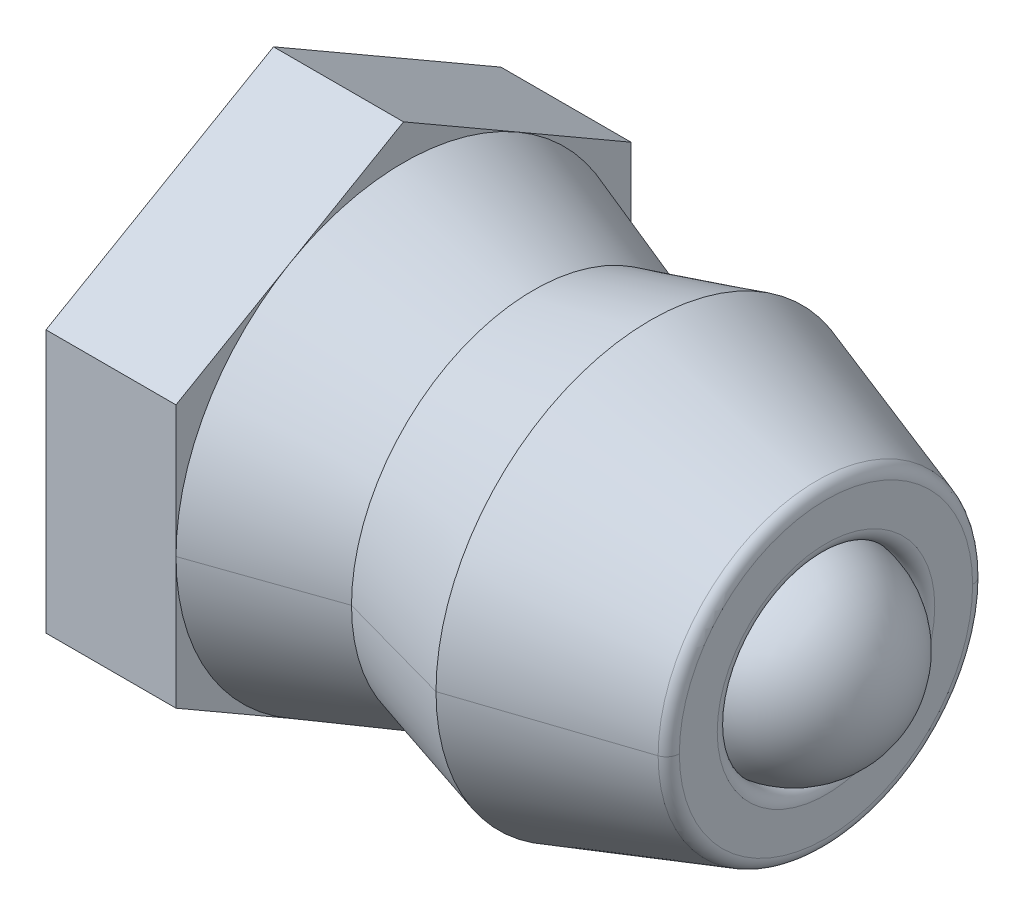
ISO-10303-21;
HEADER;
FILE_DESCRIPTION(('STEP AP214'),'2;1');
FILE_NAME('part.step','',(''),(''),'','','');
FILE_SCHEMA(('AUTOMOTIVE_DESIGN { 1 0 10303 214 1 1 1 1 }'));
ENDSEC;
DATA;
#1=APPLICATION_CONTEXT('core data for automotive mechanical design processes');
#2=APPLICATION_PROTOCOL_DEFINITION('international standard','automotive_design',2000,#1);
#3=PRODUCT_CONTEXT('',#1,'mechanical');
#4=PRODUCT('Part','Part','',(#3));
#5=PRODUCT_RELATED_PRODUCT_CATEGORY('part','',(#4));
#6=PRODUCT_DEFINITION_FORMATION('','',#4);
#7=PRODUCT_DEFINITION_CONTEXT('part definition',#1,'design');
#8=PRODUCT_DEFINITION('design','',#6,#7);
#9=PRODUCT_DEFINITION_SHAPE('','',#8);
#10=(LENGTH_UNIT() NAMED_UNIT(*) SI_UNIT(.MILLI.,.METRE.));
#11=(NAMED_UNIT(*) PLANE_ANGLE_UNIT() SI_UNIT($,.RADIAN.));
#12=(NAMED_UNIT(*) SI_UNIT($,.STERADIAN.) SOLID_ANGLE_UNIT());
#13=UNCERTAINTY_MEASURE_WITH_UNIT(LENGTH_MEASURE(1.E-05),#10,'distance_accuracy_value','');
#14=(GEOMETRIC_REPRESENTATION_CONTEXT(3) GLOBAL_UNCERTAINTY_ASSIGNED_CONTEXT((#13)) GLOBAL_UNIT_ASSIGNED_CONTEXT((#10,
#11,#12)) REPRESENTATION_CONTEXT('',''));
#15=CARTESIAN_POINT('',(0.,0.,0.));
#16=DIRECTION('',(0.,0.,1.));
#17=DIRECTION('',(1.,0.,0.));
#18=AXIS2_PLACEMENT_3D('',#15,#16,#17);
#19=CARTESIAN_POINT('',(8.,0.,0.));
#20=DIRECTION('',(-1.,0.,0.));
#21=DIRECTION('',(0.,0.,-1.));
#22=AXIS2_PLACEMENT_3D('',#19,#20,#21);
#23=SPHERICAL_SURFACE('',#22,1.5);
#24=CARTESIAN_POINT('',(6.5,0.,0.));
#25=VERTEX_POINT('',#24);
#26=VERTEX_LOOP('',#25);
#27=FACE_BOUND('',#26,.T.);
#28=ADVANCED_FACE('F40',(#27),#23,.T.);
#29=CLOSED_SHELL('',(#28));
#30=MANIFOLD_SOLID_BREP('B2',#29);
#31=CARTESIAN_POINT('',(2.,-4.0414518843274,0.));
#32=DIRECTION('',(0.,0.866025403784438,0.500000000000002));
#33=DIRECTION('',(0.,-0.500000000000002,0.866025403784438));
#34=AXIS2_PLACEMENT_3D('',#31,#32,#33);
#35=PLANE('',#34);
#36=DIRECTION('',(0.,0.500000000000002,-0.866025403784438));
#37=VECTOR('',#36,1.);
#38=CARTESIAN_POINT('',(0.,-4.0414518843274,0.));
#39=LINE('',#38,#37);
#40=CARTESIAN_POINT('',(0.,-4.0414518843274,0.));
#41=VERTEX_POINT('',#40);
#42=CARTESIAN_POINT('',(0.,-2.0207259421637,-3.5));
#43=VERTEX_POINT('',#42);
#44=EDGE_CURVE('E387',#41,#43,#39,.T.);
#45=ORIENTED_EDGE('',*,*,#44,.T.);
#46=DIRECTION('',(-1.,0.,0.));
#47=VECTOR('',#46,1.);
#48=CARTESIAN_POINT('',(2.,-2.0207259421637,-3.5));
#49=LINE('',#48,#47);
#50=CARTESIAN_POINT('',(2.,-2.0207259421637,-3.5));
#51=VERTEX_POINT('',#50);
#52=EDGE_CURVE('E382',#51,#43,#49,.T.);
#53=ORIENTED_EDGE('',*,*,#52,.F.);
#54=DIRECTION('',(0.,0.500000000000002,-0.866025403784438));
#55=VECTOR('',#54,1.);
#56=CARTESIAN_POINT('',(2.,-4.0414518843274,0.));
#57=LINE('',#56,#55);
#58=CARTESIAN_POINT('',(2.,-3.03108891324554,-1.75000000000001));
#59=VERTEX_POINT('',#58);
#60=EDGE_CURVE('E377',#59,#51,#57,.T.);
#61=ORIENTED_EDGE('',*,*,#60,.F.);
#62=DIRECTION('',(0.,0.500000000000002,-0.866025403784438));
#63=VECTOR('',#62,1.);
#64=CARTESIAN_POINT('',(2.,-4.0414518843274,0.));
#65=LINE('',#64,#63);
#66=CARTESIAN_POINT('',(2.,-4.0414518843274,0.));
#67=VERTEX_POINT('',#66);
#68=EDGE_CURVE('E372',#67,#59,#65,.T.);
#69=ORIENTED_EDGE('',*,*,#68,.F.);
#70=DIRECTION('',(-1.,0.,0.));
#71=VECTOR('',#70,1.);
#72=CARTESIAN_POINT('',(2.,-4.0414518843274,0.));
#73=LINE('',#72,#71);
#74=EDGE_CURVE('E368',#67,#41,#73,.T.);
#75=ORIENTED_EDGE('',*,*,#74,.T.);
#76=EDGE_LOOP('',(#45,#53,#61,#69,#75));
#77=FACE_BOUND('',#76,.T.);
#78=ADVANCED_FACE('F52',(#77),#35,.F.);
#79=CARTESIAN_POINT('',(2.,-2.0207259421637,3.5));
#80=DIRECTION('',(0.,0.866025403784438,-0.500000000000002));
#81=DIRECTION('',(0.,0.500000000000002,0.866025403784438));
#82=AXIS2_PLACEMENT_3D('',#79,#80,#81);
#83=PLANE('',#82);
#84=DIRECTION('',(0.,-0.500000000000002,-0.866025403784438));
#85=VECTOR('',#84,1.);
#86=CARTESIAN_POINT('',(0.,-2.0207259421637,3.5));
#87=LINE('',#86,#85);
#88=CARTESIAN_POINT('',(0.,-2.0207259421637,3.5));
#89=VERTEX_POINT('',#88);
#90=EDGE_CURVE('E363',#89,#41,#87,.T.);
#91=ORIENTED_EDGE('',*,*,#90,.T.);
#92=ORIENTED_EDGE('',*,*,#74,.F.);
#93=DIRECTION('',(0.,-0.500000000000002,-0.866025403784438));
#94=VECTOR('',#93,1.);
#95=CARTESIAN_POINT('',(2.,-2.0207259421637,3.5));
#96=LINE('',#95,#94);
#97=CARTESIAN_POINT('',(2.,-3.03108891324554,1.75000000000001));
#98=VERTEX_POINT('',#97);
#99=EDGE_CURVE('E358',#98,#67,#96,.T.);
#100=ORIENTED_EDGE('',*,*,#99,.F.);
#101=DIRECTION('',(0.,-0.500000000000002,-0.866025403784438));
#102=VECTOR('',#101,1.);
#103=CARTESIAN_POINT('',(2.,-2.0207259421637,3.5));
#104=LINE('',#103,#102);
#105=CARTESIAN_POINT('',(2.,-2.0207259421637,3.5));
#106=VERTEX_POINT('',#105);
#107=EDGE_CURVE('E353',#106,#98,#104,.T.);
#108=ORIENTED_EDGE('',*,*,#107,.F.);
#109=DIRECTION('',(-1.,0.,0.));
#110=VECTOR('',#109,1.);
#111=CARTESIAN_POINT('',(2.,-2.0207259421637,3.5));
#112=LINE('',#111,#110);
#113=EDGE_CURVE('E349',#106,#89,#112,.T.);
#114=ORIENTED_EDGE('',*,*,#113,.T.);
#115=EDGE_LOOP('',(#91,#92,#100,#108,#114));
#116=FACE_BOUND('',#115,.T.);
#117=ADVANCED_FACE('F487',(#116),#83,.F.);
#118=CARTESIAN_POINT('',(2.,2.0207259421637,3.5));
#119=DIRECTION('',(0.,0.,-1.));
#120=DIRECTION('',(-1.,0.,0.));
#121=AXIS2_PLACEMENT_3D('',#118,#119,#120);
#122=PLANE('',#121);
#123=DIRECTION('',(0.,-1.,0.));
#124=VECTOR('',#123,1.);
#125=CARTESIAN_POINT('',(0.,2.0207259421637,3.5));
#126=LINE('',#125,#124);
#127=CARTESIAN_POINT('',(0.,2.0207259421637,3.5));
#128=VERTEX_POINT('',#127);
#129=EDGE_CURVE('E344',#128,#89,#126,.T.);
#130=ORIENTED_EDGE('',*,*,#129,.T.);
#131=ORIENTED_EDGE('',*,*,#113,.F.);
#132=DIRECTION('',(0.,-1.,0.));
#133=VECTOR('',#132,1.);
#134=CARTESIAN_POINT('',(2.,2.0207259421637,3.5));
#135=LINE('',#134,#133);
#136=CARTESIAN_POINT('',(2.,0.,3.5));
#137=VERTEX_POINT('',#136);
#138=EDGE_CURVE('E339',#137,#106,#135,.T.);
#139=ORIENTED_EDGE('',*,*,#138,.F.);
#140=DIRECTION('',(0.,-1.,0.));
#141=VECTOR('',#140,1.);
#142=CARTESIAN_POINT('',(2.,2.0207259421637,3.5));
#143=LINE('',#142,#141);
#144=CARTESIAN_POINT('',(2.,2.0207259421637,3.5));
#145=VERTEX_POINT('',#144);
#146=EDGE_CURVE('E334',#145,#137,#143,.T.);
#147=ORIENTED_EDGE('',*,*,#146,.F.);
#148=DIRECTION('',(-1.,0.,0.));
#149=VECTOR('',#148,1.);
#150=CARTESIAN_POINT('',(2.,2.0207259421637,3.5));
#151=LINE('',#150,#149);
#152=EDGE_CURVE('E330',#145,#128,#151,.T.);
#153=ORIENTED_EDGE('',*,*,#152,.T.);
#154=EDGE_LOOP('',(#130,#131,#139,#147,#153));
#155=FACE_BOUND('',#154,.T.);
#156=ADVANCED_FACE('F493',(#155),#122,.F.);
#157=CARTESIAN_POINT('',(2.,4.0414518843274,0.));
#158=DIRECTION('',(0.,-0.866025403784438,-0.500000000000002));
#159=DIRECTION('',(0.,0.500000000000002,-0.866025403784438));
#160=AXIS2_PLACEMENT_3D('',#157,#158,#159);
#161=PLANE('',#160);
#162=DIRECTION('',(0.,-0.500000000000002,0.866025403784438));
#163=VECTOR('',#162,1.);
#164=CARTESIAN_POINT('',(0.,4.0414518843274,0.));
#165=LINE('',#164,#163);
#166=CARTESIAN_POINT('',(0.,4.0414518843274,0.));
#167=VERTEX_POINT('',#166);
#168=EDGE_CURVE('E325',#167,#128,#165,.T.);
#169=ORIENTED_EDGE('',*,*,#168,.T.);
#170=ORIENTED_EDGE('',*,*,#152,.F.);
#171=DIRECTION('',(0.,-0.500000000000002,0.866025403784438));
#172=VECTOR('',#171,1.);
#173=CARTESIAN_POINT('',(2.,4.0414518843274,0.));
#174=LINE('',#173,#172);
#175=CARTESIAN_POINT('',(2.,3.03108891324554,1.75000000000001));
#176=VERTEX_POINT('',#175);
#177=EDGE_CURVE('E320',#176,#145,#174,.T.);
#178=ORIENTED_EDGE('',*,*,#177,.F.);
#179=DIRECTION('',(0.,-0.500000000000002,0.866025403784438));
#180=VECTOR('',#179,1.);
#181=CARTESIAN_POINT('',(2.,4.0414518843274,0.));
#182=LINE('',#181,#180);
#183=CARTESIAN_POINT('',(2.,4.0414518843274,0.));
#184=VERTEX_POINT('',#183);
#185=EDGE_CURVE('E315',#184,#176,#182,.T.);
#186=ORIENTED_EDGE('',*,*,#185,.F.);
#187=DIRECTION('',(-1.,0.,0.));
#188=VECTOR('',#187,1.);
#189=CARTESIAN_POINT('',(2.,4.0414518843274,0.));
#190=LINE('',#189,#188);
#191=EDGE_CURVE('E311',#184,#167,#190,.T.);
#192=ORIENTED_EDGE('',*,*,#191,.T.);
#193=EDGE_LOOP('',(#169,#170,#178,#186,#192));
#194=FACE_BOUND('',#193,.T.);
#195=ADVANCED_FACE('F581',(#194),#161,.F.);
#196=CARTESIAN_POINT('',(2.,2.0207259421637,-3.5));
#197=DIRECTION('',(0.,-0.866025403784438,0.500000000000002));
#198=DIRECTION('',(0.,-0.500000000000002,-0.866025403784438));
#199=AXIS2_PLACEMENT_3D('',#196,#197,#198);
#200=PLANE('',#199);
#201=DIRECTION('',(0.,0.500000000000002,0.866025403784438));
#202=VECTOR('',#201,1.);
#203=CARTESIAN_POINT('',(0.,2.0207259421637,-3.5));
#204=LINE('',#203,#202);
#205=CARTESIAN_POINT('',(0.,2.0207259421637,-3.5));
#206=VERTEX_POINT('',#205);
#207=EDGE_CURVE('E306',#206,#167,#204,.T.);
#208=ORIENTED_EDGE('',*,*,#207,.T.);
#209=ORIENTED_EDGE('',*,*,#191,.F.);
#210=DIRECTION('',(0.,0.500000000000002,0.866025403784438));
#211=VECTOR('',#210,1.);
#212=CARTESIAN_POINT('',(2.,2.0207259421637,-3.5));
#213=LINE('',#212,#211);
#214=CARTESIAN_POINT('',(2.,3.03108891324554,-1.75000000000001));
#215=VERTEX_POINT('',#214);
#216=EDGE_CURVE('E301',#215,#184,#213,.T.);
#217=ORIENTED_EDGE('',*,*,#216,.F.);
#218=DIRECTION('',(0.,0.500000000000002,0.866025403784438));
#219=VECTOR('',#218,1.);
#220=CARTESIAN_POINT('',(2.,2.0207259421637,-3.5));
#221=LINE('',#220,#219);
#222=CARTESIAN_POINT('',(2.,2.0207259421637,-3.5));
#223=VERTEX_POINT('',#222);
#224=EDGE_CURVE('E296',#223,#215,#221,.T.);
#225=ORIENTED_EDGE('',*,*,#224,.F.);
#226=DIRECTION('',(-1.,0.,0.));
#227=VECTOR('',#226,1.);
#228=CARTESIAN_POINT('',(2.,2.0207259421637,-3.5));
#229=LINE('',#228,#227);
#230=EDGE_CURVE('E292',#223,#206,#229,.T.);
#231=ORIENTED_EDGE('',*,*,#230,.T.);
#232=EDGE_LOOP('',(#208,#209,#217,#225,#231));
#233=FACE_BOUND('',#232,.T.);
#234=ADVANCED_FACE('F576',(#233),#200,.F.);
#235=CARTESIAN_POINT('',(2.,-2.0207259421637,-3.5));
#236=DIRECTION('',(0.,0.,1.));
#237=DIRECTION('',(1.,0.,0.));
#238=AXIS2_PLACEMENT_3D('',#235,#236,#237);
#239=PLANE('',#238);
#240=DIRECTION('',(0.,1.,0.));
#241=VECTOR('',#240,1.);
#242=CARTESIAN_POINT('',(0.,-2.0207259421637,-3.5));
#243=LINE('',#242,#241);
#244=EDGE_CURVE('E287',#43,#206,#243,.T.);
#245=ORIENTED_EDGE('',*,*,#244,.T.);
#246=ORIENTED_EDGE('',*,*,#230,.F.);
#247=DIRECTION('',(0.,1.,0.));
#248=VECTOR('',#247,1.);
#249=CARTESIAN_POINT('',(2.,-2.0207259421637,-3.5));
#250=LINE('',#249,#248);
#251=CARTESIAN_POINT('',(2.,0.,-3.5));
#252=VERTEX_POINT('',#251);
#253=EDGE_CURVE('E282',#252,#223,#250,.T.);
#254=ORIENTED_EDGE('',*,*,#253,.F.);
#255=DIRECTION('',(0.,1.,0.));
#256=VECTOR('',#255,1.);
#257=CARTESIAN_POINT('',(2.,-2.0207259421637,-3.5));
#258=LINE('',#257,#256);
#259=EDGE_CURVE('E277',#51,#252,#258,.T.);
#260=ORIENTED_EDGE('',*,*,#259,.F.);
#261=ORIENTED_EDGE('',*,*,#52,.T.);
#262=EDGE_LOOP('',(#245,#246,#254,#260,#261));
#263=FACE_BOUND('',#262,.T.);
#264=ADVANCED_FACE('F566',(#263),#239,.F.);
#265=CARTESIAN_POINT('',(2.,4.2,0.));
#266=DIRECTION('',(-1.,0.,0.));
#267=DIRECTION('',(0.,0.,1.));
#268=AXIS2_PLACEMENT_3D('',#265,#266,#267);
#269=PLANE('',#268);
#270=ORIENTED_EDGE('',*,*,#60,.T.);
#271=ORIENTED_EDGE('',*,*,#259,.T.);
#272=CARTESIAN_POINT('',(2.,0.,0.));
#273=DIRECTION('',(1.,0.,0.));
#274=DIRECTION('',(0.,0.,-1.));
#275=AXIS2_PLACEMENT_3D('',#272,#273,#274);
#276=CIRCLE('',#275,3.5);
#277=EDGE_CURVE('E273',#59,#252,#276,.T.);
#278=ORIENTED_EDGE('',*,*,#277,.F.);
#279=EDGE_LOOP('',(#270,#271,#278));
#280=FACE_BOUND('',#279,.T.);
#281=ADVANCED_FACE('F570',(#280),#269,.F.);
#282=CARTESIAN_POINT('',(2.,0.,0.));
#283=DIRECTION('',(-1.,0.,0.));
#284=DIRECTION('',(0.,1.,0.));
#285=AXIS2_PLACEMENT_3D('',#282,#283,#284);
#286=CONICAL_SURFACE('',#285,3.5,0.336674819386727);
#287=CARTESIAN_POINT('',(2.,0.,0.));
#288=DIRECTION('',(1.,0.,0.));
#289=DIRECTION('',(0.,0.,-1.));
#290=AXIS2_PLACEMENT_3D('',#287,#288,#289);
#291=CIRCLE('',#290,3.5);
#292=EDGE_CURVE('E269',#137,#98,#291,.T.);
#293=ORIENTED_EDGE('',*,*,#292,.T.);
#294=CARTESIAN_POINT('',(2.,0.,0.));
#295=DIRECTION('',(1.,0.,0.));
#296=DIRECTION('',(0.,0.,-1.));
#297=AXIS2_PLACEMENT_3D('',#294,#295,#296);
#298=CIRCLE('',#297,3.5);
#299=EDGE_CURVE('E266',#98,#59,#298,.T.);
#300=ORIENTED_EDGE('',*,*,#299,.T.);
#301=ORIENTED_EDGE('',*,*,#277,.T.);
#302=CARTESIAN_POINT('',(4.,0.,-2.8));
#303=DIRECTION('',(-0.943858356366017,0.,-0.330350424728106));
#304=VECTOR('',#303,1.);
#305=LINE('',#302,#304);
#306=CARTESIAN_POINT('',(4.,0.,-2.8));
#307=VERTEX_POINT('',#306);
#308=EDGE_CURVE('E233',#307,#252,#305,.T.);
#309=ORIENTED_EDGE('',*,*,#308,.F.);
#310=CARTESIAN_POINT('',(4.,0.,0.));
#311=DIRECTION('',(1.,0.,0.));
#312=DIRECTION('',(0.,0.,-1.));
#313=AXIS2_PLACEMENT_3D('',#310,#311,#312);
#314=CIRCLE('',#313,2.8);
#315=CARTESIAN_POINT('',(4.,0.,2.8));
#316=VERTEX_POINT('',#315);
#317=EDGE_CURVE('E252',#316,#307,#314,.T.);
#318=ORIENTED_EDGE('',*,*,#317,.F.);
#319=CARTESIAN_POINT('',(4.,0.,2.8));
#320=DIRECTION('',(-0.943858356366017,0.,0.330350424728106));
#321=VECTOR('',#320,1.);
#322=LINE('',#319,#321);
#323=EDGE_CURVE('E236',#316,#137,#322,.T.);
#324=ORIENTED_EDGE('',*,*,#323,.T.);
#325=EDGE_LOOP('',(#293,#300,#301,#309,#318,#324));
#326=FACE_BOUND('',#325,.T.);
#327=ADVANCED_FACE('F212',(#326),#286,.T.);
#328=CARTESIAN_POINT('',(2.,0.,0.));
#329=DIRECTION('',(-1.,0.,0.));
#330=DIRECTION('',(0.,-1.,0.));
#331=AXIS2_PLACEMENT_3D('',#328,#329,#330);
#332=CONICAL_SURFACE('',#331,3.5,0.336674819386727);
#333=CARTESIAN_POINT('',(4.,0.,0.));
#334=DIRECTION('',(1.,0.,0.));
#335=DIRECTION('',(0.,0.,-1.));
#336=AXIS2_PLACEMENT_3D('',#333,#334,#335);
#337=CIRCLE('',#336,2.8);
#338=EDGE_CURVE('E175',#307,#316,#337,.T.);
#339=ORIENTED_EDGE('',*,*,#338,.F.);
#340=ORIENTED_EDGE('',*,*,#308,.T.);
#341=CARTESIAN_POINT('',(2.,0.,0.));
#342=DIRECTION('',(1.,0.,0.));
#343=DIRECTION('',(0.,0.,-1.));
#344=AXIS2_PLACEMENT_3D('',#341,#342,#343);
#345=CIRCLE('',#344,3.5);
#346=EDGE_CURVE('E237',#252,#215,#345,.T.);
#347=ORIENTED_EDGE('',*,*,#346,.T.);
#348=CARTESIAN_POINT('',(2.,0.,0.));
#349=DIRECTION('',(1.,0.,0.));
#350=DIRECTION('',(0.,0.,-1.));
#351=AXIS2_PLACEMENT_3D('',#348,#349,#350);
#352=CIRCLE('',#351,3.5);
#353=EDGE_CURVE('E190',#215,#176,#352,.T.);
#354=ORIENTED_EDGE('',*,*,#353,.T.);
#355=CARTESIAN_POINT('',(2.,0.,0.));
#356=DIRECTION('',(1.,0.,0.));
#357=DIRECTION('',(0.,0.,-1.));
#358=AXIS2_PLACEMENT_3D('',#355,#356,#357);
#359=CIRCLE('',#358,3.5);
#360=EDGE_CURVE('E187',#176,#137,#359,.T.);
#361=ORIENTED_EDGE('',*,*,#360,.T.);
#362=ORIENTED_EDGE('',*,*,#323,.F.);
#363=EDGE_LOOP('',(#339,#340,#347,#354,#361,#362));
#364=FACE_BOUND('',#363,.T.);
#365=ADVANCED_FACE('F201',(#364),#332,.T.);
#366=CARTESIAN_POINT('',(2.,4.2,0.));
#367=DIRECTION('',(-1.,0.,0.));
#368=DIRECTION('',(0.,0.,1.));
#369=AXIS2_PLACEMENT_3D('',#366,#367,#368);
#370=PLANE('',#369);
#371=ORIENTED_EDGE('',*,*,#360,.F.);
#372=ORIENTED_EDGE('',*,*,#177,.T.);
#373=ORIENTED_EDGE('',*,*,#146,.T.);
#374=EDGE_LOOP('',(#371,#372,#373));
#375=FACE_BOUND('',#374,.T.);
#376=ADVANCED_FACE('F211',(#375),#370,.F.);
#377=CARTESIAN_POINT('',(2.,4.2,0.));
#378=DIRECTION('',(-1.,0.,0.));
#379=DIRECTION('',(0.,0.,1.));
#380=AXIS2_PLACEMENT_3D('',#377,#378,#379);
#381=PLANE('',#380);
#382=ORIENTED_EDGE('',*,*,#353,.F.);
#383=ORIENTED_EDGE('',*,*,#216,.T.);
#384=ORIENTED_EDGE('',*,*,#185,.T.);
#385=EDGE_LOOP('',(#382,#383,#384));
#386=FACE_BOUND('',#385,.T.);
#387=ADVANCED_FACE('F477',(#386),#381,.F.);
#388=CARTESIAN_POINT('',(2.,4.2,0.));
#389=DIRECTION('',(-1.,0.,0.));
#390=DIRECTION('',(0.,0.,1.));
#391=AXIS2_PLACEMENT_3D('',#388,#389,#390);
#392=PLANE('',#391);
#393=ORIENTED_EDGE('',*,*,#253,.T.);
#394=ORIENTED_EDGE('',*,*,#224,.T.);
#395=ORIENTED_EDGE('',*,*,#346,.F.);
#396=EDGE_LOOP('',(#393,#394,#395));
#397=FACE_BOUND('',#396,.T.);
#398=ADVANCED_FACE('F467',(#397),#392,.F.);
#399=CARTESIAN_POINT('',(4.,0.,0.));
#400=DIRECTION('',(1.,0.,0.));
#401=DIRECTION('',(0.,-1.,0.));
#402=AXIS2_PLACEMENT_3D('',#399,#400,#401);
#403=CONICAL_SURFACE('',#402,2.8,0.270946850338421);
#404=CARTESIAN_POINT('',(5.8,0.,0.));
#405=DIRECTION('',(1.,0.,0.));
#406=DIRECTION('',(0.,0.,-1.));
#407=AXIS2_PLACEMENT_3D('',#404,#405,#406);
#408=CIRCLE('',#407,3.3);
#409=CARTESIAN_POINT('',(5.8,0.,-3.3));
#410=VERTEX_POINT('',#409);
#411=CARTESIAN_POINT('',(5.8,0.,3.3));
#412=VERTEX_POINT('',#411);
#413=EDGE_CURVE('E172',#410,#412,#408,.T.);
#414=ORIENTED_EDGE('',*,*,#413,.F.);
#415=CARTESIAN_POINT('',(4.,0.,-2.8));
#416=DIRECTION('',(0.96351790962994,0.,-0.267643863786095));
#417=VECTOR('',#416,1.);
#418=LINE('',#415,#417);
#419=EDGE_CURVE('E179',#307,#410,#418,.T.);
#420=ORIENTED_EDGE('',*,*,#419,.F.);
#421=ORIENTED_EDGE('',*,*,#338,.T.);
#422=CARTESIAN_POINT('',(4.,0.,2.8));
#423=DIRECTION('',(0.96351790962994,0.,0.267643863786095));
#424=VECTOR('',#423,1.);
#425=LINE('',#422,#424);
#426=EDGE_CURVE('E168',#316,#412,#425,.T.);
#427=ORIENTED_EDGE('',*,*,#426,.T.);
#428=EDGE_LOOP('',(#414,#420,#421,#427));
#429=FACE_BOUND('',#428,.T.);
#430=ADVANCED_FACE('F170',(#429),#403,.T.);
#431=CARTESIAN_POINT('',(4.,0.,0.));
#432=DIRECTION('',(1.,0.,0.));
#433=DIRECTION('',(0.,1.,0.));
#434=AXIS2_PLACEMENT_3D('',#431,#432,#433);
#435=CONICAL_SURFACE('',#434,2.8,0.270946850338421);
#436=ORIENTED_EDGE('',*,*,#317,.T.);
#437=ORIENTED_EDGE('',*,*,#419,.T.);
#438=CARTESIAN_POINT('',(5.8,0.,0.));
#439=DIRECTION('',(1.,0.,0.));
#440=DIRECTION('',(0.,0.,-1.));
#441=AXIS2_PLACEMENT_3D('',#438,#439,#440);
#442=CIRCLE('',#441,3.3);
#443=EDGE_CURVE('E157',#412,#410,#442,.T.);
#444=ORIENTED_EDGE('',*,*,#443,.F.);
#445=ORIENTED_EDGE('',*,*,#426,.F.);
#446=EDGE_LOOP('',(#436,#437,#444,#445));
#447=FACE_BOUND('',#446,.T.);
#448=ADVANCED_FACE('F182',(#447),#435,.T.);
#449=CARTESIAN_POINT('',(5.8,0.,0.));
#450=DIRECTION('',(-1.,0.,0.));
#451=DIRECTION('',(0.,1.,0.));
#452=AXIS2_PLACEMENT_3D('',#449,#450,#451);
#453=CONICAL_SURFACE('',#452,3.3,0.321750554396642);
#454=CARTESIAN_POINT('',(8.36324555320337,0.,-2.44558481559888));
#455=DIRECTION('',(-0.948683298050514,0.,-0.316227766016838));
#456=VECTOR('',#455,1.);
#457=LINE('',#454,#456);
#458=CARTESIAN_POINT('',(8.36324555320337,0.,-2.44558481559888));
#459=VERTEX_POINT('',#458);
#460=EDGE_CURVE('E161',#459,#410,#457,.T.);
#461=ORIENTED_EDGE('',*,*,#460,.F.);
#462=CARTESIAN_POINT('',(8.36324555320337,0.,0.));
#463=DIRECTION('',(-1.,0.,0.));
#464=DIRECTION('',(0.,0.,1.));
#465=AXIS2_PLACEMENT_3D('',#462,#463,#464);
#466=CIRCLE('',#465,2.44558481559888);
#467=CARTESIAN_POINT('',(8.36324555320337,0.,2.44558481559888));
#468=VERTEX_POINT('',#467);
#469=EDGE_CURVE('E158',#459,#468,#466,.T.);
#470=ORIENTED_EDGE('',*,*,#469,.T.);
#471=CARTESIAN_POINT('',(8.36324555320337,0.,2.44558481559888));
#472=DIRECTION('',(-0.948683298050514,0.,0.316227766016838));
#473=VECTOR('',#472,1.);
#474=LINE('',#471,#473);
#475=EDGE_CURVE('E152',#468,#412,#474,.T.);
#476=ORIENTED_EDGE('',*,*,#475,.T.);
#477=ORIENTED_EDGE('',*,*,#443,.T.);
#478=EDGE_LOOP('',(#461,#470,#476,#477));
#479=FACE_BOUND('',#478,.T.);
#480=ADVANCED_FACE('F155',(#479),#453,.T.);
#481=CARTESIAN_POINT('',(5.8,0.,0.));
#482=DIRECTION('',(-1.,0.,0.));
#483=DIRECTION('',(0.,-1.,0.));
#484=AXIS2_PLACEMENT_3D('',#481,#482,#483);
#485=CONICAL_SURFACE('',#484,3.3,0.321750554396642);
#486=ORIENTED_EDGE('',*,*,#475,.F.);
#487=CARTESIAN_POINT('',(8.36324555320337,0.,0.));
#488=DIRECTION('',(-1.,0.,0.));
#489=DIRECTION('',(0.,0.,1.));
#490=AXIS2_PLACEMENT_3D('',#487,#488,#489);
#491=CIRCLE('',#490,2.44558481559888);
#492=EDGE_CURVE('E62',#468,#459,#491,.T.);
#493=ORIENTED_EDGE('',*,*,#492,.T.);
#494=ORIENTED_EDGE('',*,*,#460,.T.);
#495=ORIENTED_EDGE('',*,*,#413,.T.);
#496=EDGE_LOOP('',(#486,#493,#494,#495));
#497=FACE_BOUND('',#496,.T.);
#498=ADVANCED_FACE('F185',(#497),#485,.T.);
#499=CARTESIAN_POINT('',(8.5,2.4,0.));
#500=DIRECTION('',(-1.,0.,0.));
#501=DIRECTION('',(0.,0.,1.));
#502=AXIS2_PLACEMENT_3D('',#499,#500,#501);
#503=PLANE('',#502);
#504=CARTESIAN_POINT('',(8.5,0.,0.));
#505=DIRECTION('',(-1.,0.,0.));
#506=DIRECTION('',(0.,0.,1.));
#507=AXIS2_PLACEMENT_3D('',#504,#505,#506);
#508=CIRCLE('',#507,2.25584815598877);
#509=CARTESIAN_POINT('',(8.5,0.,-2.25584815598877));
#510=VERTEX_POINT('',#509);
#511=CARTESIAN_POINT('',(8.5,0.,2.25584815598877));
#512=VERTEX_POINT('',#511);
#513=EDGE_CURVE('E396',#510,#512,#508,.F.);
#514=ORIENTED_EDGE('',*,*,#513,.T.);
#515=CARTESIAN_POINT('',(8.5,0.,0.));
#516=DIRECTION('',(-1.,0.,0.));
#517=DIRECTION('',(0.,0.,1.));
#518=AXIS2_PLACEMENT_3D('',#515,#516,#517);
#519=CIRCLE('',#518,2.25584815598877);
#520=EDGE_CURVE('E398',#512,#510,#519,.F.);
#521=ORIENTED_EDGE('',*,*,#520,.T.);
#522=EDGE_LOOP('',(#514,#521));
#523=FACE_BOUND('',#522,.T.);
#524=CARTESIAN_POINT('',(8.5,0.,0.));
#525=DIRECTION('',(-1.,0.,0.));
#526=DIRECTION('',(0.,0.,1.));
#527=AXIS2_PLACEMENT_3D('',#524,#525,#526);
#528=CIRCLE('',#527,1.67332005306815);
#529=CARTESIAN_POINT('',(8.5,0.,1.67332005306815));
#530=VERTEX_POINT('',#529);
#531=EDGE_CURVE('E391',#530,#530,#528,.T.);
#532=ORIENTED_EDGE('',*,*,#531,.T.);
#533=EDGE_LOOP('',(#532));
#534=FACE_BOUND('',#533,.T.);
#535=ADVANCED_FACE('F423',(#523,#534),#503,.F.);
#536=CARTESIAN_POINT('',(2.,4.2,0.));
#537=DIRECTION('',(-1.,0.,0.));
#538=DIRECTION('',(0.,0.,1.));
#539=AXIS2_PLACEMENT_3D('',#536,#537,#538);
#540=PLANE('',#539);
#541=ORIENTED_EDGE('',*,*,#99,.T.);
#542=ORIENTED_EDGE('',*,*,#68,.T.);
#543=ORIENTED_EDGE('',*,*,#299,.F.);
#544=EDGE_LOOP('',(#541,#542,#543));
#545=FACE_BOUND('',#544,.T.);
#546=ADVANCED_FACE('F525',(#545),#540,.F.);
#547=CARTESIAN_POINT('',(2.,4.2,0.));
#548=DIRECTION('',(-1.,0.,0.));
#549=DIRECTION('',(0.,0.,1.));
#550=AXIS2_PLACEMENT_3D('',#547,#548,#549);
#551=PLANE('',#550);
#552=ORIENTED_EDGE('',*,*,#292,.F.);
#553=ORIENTED_EDGE('',*,*,#138,.T.);
#554=ORIENTED_EDGE('',*,*,#107,.T.);
#555=EDGE_LOOP('',(#552,#553,#554));
#556=FACE_BOUND('',#555,.T.);
#557=ADVANCED_FACE('F542',(#556),#551,.F.);
#558=CARTESIAN_POINT('',(0.,0.,0.));
#559=DIRECTION('',(1.,0.,0.));
#560=DIRECTION('',(0.,0.,-1.));
#561=AXIS2_PLACEMENT_3D('',#558,#559,#560);
#562=PLANE('',#561);
#563=ORIENTED_EDGE('',*,*,#168,.F.);
#564=ORIENTED_EDGE('',*,*,#207,.F.);
#565=ORIENTED_EDGE('',*,*,#244,.F.);
#566=ORIENTED_EDGE('',*,*,#44,.F.);
#567=ORIENTED_EDGE('',*,*,#90,.F.);
#568=ORIENTED_EDGE('',*,*,#129,.F.);
#569=EDGE_LOOP('',(#563,#564,#565,#566,#567,#568));
#570=FACE_BOUND('',#569,.T.);
#571=ADVANCED_FACE('F536',(#570),#562,.F.);
#572=CARTESIAN_POINT('',(8.,0.,0.));
#573=DIRECTION('',(-1.,0.,0.));
#574=DIRECTION('',(0.,0.,-1.));
#575=AXIS2_PLACEMENT_3D('',#572,#573,#574);
#576=SPHERICAL_SURFACE('',#575,1.5);
#577=CARTESIAN_POINT('',(8.26470588235294,0.,0.));
#578=DIRECTION('',(-1.,0.,0.));
#579=DIRECTION('',(0.,0.,1.));
#580=AXIS2_PLACEMENT_3D('',#577,#578,#579);
#581=CIRCLE('',#580,1.47645887035425);
#582=CARTESIAN_POINT('',(8.26470588235294,0.,1.47645887035425));
#583=VERTEX_POINT('',#582);
#584=EDGE_CURVE('E38',#583,#583,#581,.F.);
#585=ORIENTED_EDGE('',*,*,#584,.T.);
#586=EDGE_LOOP('',(#585));
#587=FACE_BOUND('',#586,.T.);
#588=ADVANCED_FACE('F534',(#587),#576,.F.);
#589=CARTESIAN_POINT('',(8.3,0.,0.));
#590=DIRECTION('',(-1.,0.,0.));
#591=DIRECTION('',(0.,0.,1.));
#592=AXIS2_PLACEMENT_3D('',#589,#590,#591);
#593=TOROIDAL_SURFACE('',#592,2.25584815598877,0.2);
#594=CARTESIAN_POINT('',(8.36324555320337,0.,-2.44558481559888));
#595=CARTESIAN_POINT('',(8.36571420644434,0.,-2.44476196045205));
#596=CARTESIAN_POINT('',(8.36816678102852,0.,-2.44389087527376));
#597=CARTESIAN_POINT('',(8.37303607980919,0.,-2.4420536859866));
#598=CARTESIAN_POINT('',(8.37545280400568,0.,-2.44108758187774));
#599=CARTESIAN_POINT('',(8.38024670893687,0.,-2.43906179586186));
#600=CARTESIAN_POINT('',(8.38262388967157,0.,-2.43800211395483));
#601=CARTESIAN_POINT('',(8.38733508947736,0.,-2.43579079481238));
#602=CARTESIAN_POINT('',(8.38966910854846,0.,-2.43463915757697));
#603=CARTESIAN_POINT('',(8.39429042865481,0.,-2.4322456799359));
#604=CARTESIAN_POINT('',(8.39657772969007,0.,-2.43100383953025));
#605=CARTESIAN_POINT('',(8.40110212957138,0.,-2.42843184790308));
#606=CARTESIAN_POINT('',(8.40333922841744,0.,-2.42710169668156));
#607=CARTESIAN_POINT('',(8.40775981596131,0.,-2.42435510955979));
#608=CARTESIAN_POINT('',(8.40994330465912,0.,-2.42293867365953));
#609=CARTESIAN_POINT('',(8.41425334569028,0.,-2.42002167495965));
#610=CARTESIAN_POINT('',(8.41637989802363,0.,-2.41852111216004));
#611=CARTESIAN_POINT('',(8.42057282682381,0.,-2.41543814554255));
#612=CARTESIAN_POINT('',(8.42263920329063,0.,-2.41385574172467));
#613=CARTESIAN_POINT('',(8.42670863253046,0.,-2.41061150363918));
#614=CARTESIAN_POINT('',(8.42871168530345,0.,-2.40894966937156));
#615=CARTESIAN_POINT('',(8.43265141579141,0.,-2.40554910195215));
#616=CARTESIAN_POINT('',(8.43458809350637,0.,-2.40381036880036));
#617=CARTESIAN_POINT('',(8.43839212362733,0.,-2.40025865232365));
#618=CARTESIAN_POINT('',(8.44025947603334,0.,-2.39844566899873));
#619=CARTESIAN_POINT('',(8.44392201089256,0.,-2.39474821399602));
#620=CARTESIAN_POINT('',(8.44571719334576,0.,-2.39286374231824));
#621=CARTESIAN_POINT('',(8.44923265359614,0.,-2.3890261813324));
#622=CARTESIAN_POINT('',(8.45095293139331,0.,-2.38707309202434));
#623=CARTESIAN_POINT('',(8.45431596173488,0.,-2.38310127102967));
#624=CARTESIAN_POINT('',(8.45595871427928,0.,-2.38108253934305));
#625=CARTESIAN_POINT('',(8.45916419161719,0.,-2.37698250883973));
#626=CARTESIAN_POINT('',(8.4607269164107,0.,-2.37490121002302));
#627=CARTESIAN_POINT('',(8.46376995765952,0.,-2.37067921582004));
#628=CARTESIAN_POINT('',(8.46525027411483,0.,-2.36853852043376));
#629=CARTESIAN_POINT('',(8.46812624363725,0.,-2.36420099413434));
#630=CARTESIAN_POINT('',(8.46952189670436,0.,-2.3620041632212));
#631=CARTESIAN_POINT('',(8.47222641337289,0.,-2.35755771242515));
#632=CARTESIAN_POINT('',(8.47353527697431,0.,-2.35530809254225));
#633=CARTESIAN_POINT('',(8.47606422084534,0.,-2.35075949078025));
#634=CARTESIAN_POINT('',(8.47728430111493,0.,-2.34846050890115));
#635=CARTESIAN_POINT('',(8.4796338197048,0.,-2.34381668531623));
#636=CARTESIAN_POINT('',(8.48076325802508,0.,-2.34147184361041));
#637=CARTESIAN_POINT('',(8.48292977217893,0.,-2.33673987240241));
#638=CARTESIAN_POINT('',(8.4839668480125,0.,-2.33435274290023));
#639=CARTESIAN_POINT('',(8.48594705735628,0.,-2.32953983254926));
#640=CARTESIAN_POINT('',(8.48689019086648,0.,-2.32711405170047));
#641=CARTESIAN_POINT('',(8.48868107883561,0.,-2.32222753398585));
#642=CARTESIAN_POINT('',(8.48952883329455,0.,-2.31976679712002));
#643=CARTESIAN_POINT('',(8.49112767172546,0.,-2.31481411595122));
#644=CARTESIAN_POINT('',(8.49187875569744,0.,-2.31232217164826));
#645=CARTESIAN_POINT('',(8.49328310899772,0.,-2.30731087172575));
#646=CARTESIAN_POINT('',(8.49393637832602,0.,-2.3047915161062));
#647=CARTESIAN_POINT('',(8.49514410713161,0.,-2.29972923142607));
#648=CARTESIAN_POINT('',(8.4956985666089,0.,-2.29718630236549));
#649=CARTESIAN_POINT('',(8.49670783124128,0.,-2.29208074459791));
#650=CARTESIAN_POINT('',(8.49716263639639,0.,-2.28951811589092));
#651=CARTESIAN_POINT('',(8.49797189892545,0.,-2.28437706260363));
#652=CARTESIAN_POINT('',(8.4983263562994,0.,-2.28179863802333));
#653=CARTESIAN_POINT('',(8.49893438564665,0.,-2.27662992094143));
#654=CARTESIAN_POINT('',(8.49918795761994,0.,-2.27403962843982));
#655=CARTESIAN_POINT('',(8.49959382113175,0.,-2.26885112111293));
#656=CARTESIAN_POINT('',(8.49974611267027,0.,-2.26625290628764));
#657=CARTESIAN_POINT('',(8.49994921598687,0.,-2.26105251359718));
#658=CARTESIAN_POINT('',(8.50000002776496,0.,-2.258450335732));
#659=CARTESIAN_POINT('',(8.5,0.,-2.25584815598877));
#660=B_SPLINE_CURVE_WITH_KNOTS('',3,(#594,#595,#596,#597,#598,#599,#600,#601,#602,#603,#604,
#605,#606,#607,#608,#609,#610,#611,#612,#613,#614,#615,#616,#617,#618,#619,#620,#621,#622,#623,
#624,#625,#626,#627,#628,#629,#630,#631,#632,#633,#634,#635,#636,#637,#638,#639,#640,#641,#642,
#643,#644,#645,#646,#647,#648,#649,#650,#651,#652,#653,#654,#655,#656,#657,#658,#659),
.UNSPECIFIED.,.F.,.F.,(4,2,2,2,2,2,2,2,2,2,2,2,2,2,2,2,2,2,2,2,2,2,2,2,2,2,2,2,2,2,2,2,4),(0.,
0.00780604051821328,0.0156120810364269,0.023418121554641,0.0312241620728532,0.0390302025910669,
0.0468362431092809,0.0546422836274945,0.0624483241457075,0.0702543646639214,0.0780604051821356,
0.0858664457003489,0.0936724862185618,0.101478526736776,0.109284567254989,0.117090607773202,
0.124896648291416,0.132702688809629,0.140508729327843,0.148314769846057,0.15612081036427,
0.163926850882483,0.171732891400697,0.17953893191891,0.187344972437124,0.195151012955337,
0.202957053473551,0.210763093991764,0.218569134509978,0.226375175028191,0.234181215546405,
0.241987256064618,0.249793296582832),.UNSPECIFIED.);
#661=EDGE_CURVE('E521',#459,#510,#660,.T.);
#662=ORIENTED_EDGE('',*,*,#661,.F.);
#663=ORIENTED_EDGE('',*,*,#492,.F.);
#664=CARTESIAN_POINT('',(8.5,0.,2.25584815598877));
#665=CARTESIAN_POINT('',(8.50000002776496,0.,2.258450335732));
#666=CARTESIAN_POINT('',(8.49994921598687,0.,2.26105251359718));
#667=CARTESIAN_POINT('',(8.49974611267027,0.,2.26625290628764));
#668=CARTESIAN_POINT('',(8.49959382113175,0.,2.26885112111293));
#669=CARTESIAN_POINT('',(8.49918795761994,0.,2.27403962843982));
#670=CARTESIAN_POINT('',(8.49893438564665,0.,2.27662992094143));
#671=CARTESIAN_POINT('',(8.4983263562994,0.,2.28179863802333));
#672=CARTESIAN_POINT('',(8.49797189892545,0.,2.28437706260363));
#673=CARTESIAN_POINT('',(8.49716263639639,0.,2.28951811589092));
#674=CARTESIAN_POINT('',(8.49670783124128,0.,2.29208074459791));
#675=CARTESIAN_POINT('',(8.4956985666089,0.,2.29718630236549));
#676=CARTESIAN_POINT('',(8.49514410713161,0.,2.29972923142607));
#677=CARTESIAN_POINT('',(8.49393637832602,0.,2.3047915161062));
#678=CARTESIAN_POINT('',(8.49328310899772,0.,2.30731087172575));
#679=CARTESIAN_POINT('',(8.49187875569744,0.,2.31232217164826));
#680=CARTESIAN_POINT('',(8.49112767172546,0.,2.31481411595122));
#681=CARTESIAN_POINT('',(8.48952883329455,0.,2.31976679712002));
#682=CARTESIAN_POINT('',(8.48868107883561,0.,2.32222753398585));
#683=CARTESIAN_POINT('',(8.48689019086648,0.,2.32711405170047));
#684=CARTESIAN_POINT('',(8.48594705735628,0.,2.32953983254926));
#685=CARTESIAN_POINT('',(8.4839668480125,0.,2.33435274290023));
#686=CARTESIAN_POINT('',(8.48292977217893,0.,2.33673987240241));
#687=CARTESIAN_POINT('',(8.48076325802508,0.,2.34147184361041));
#688=CARTESIAN_POINT('',(8.4796338197048,0.,2.34381668531623));
#689=CARTESIAN_POINT('',(8.47728430111493,0.,2.34846050890115));
#690=CARTESIAN_POINT('',(8.47606422084534,0.,2.35075949078025));
#691=CARTESIAN_POINT('',(8.47353527697431,0.,2.35530809254225));
#692=CARTESIAN_POINT('',(8.47222641337289,0.,2.35755771242515));
#693=CARTESIAN_POINT('',(8.46952189670436,0.,2.3620041632212));
#694=CARTESIAN_POINT('',(8.46812624363725,0.,2.36420099413434));
#695=CARTESIAN_POINT('',(8.46525027411483,0.,2.36853852043376));
#696=CARTESIAN_POINT('',(8.46376995765952,0.,2.37067921582004));
#697=CARTESIAN_POINT('',(8.4607269164107,0.,2.37490121002302));
#698=CARTESIAN_POINT('',(8.45916419161719,0.,2.37698250883973));
#699=CARTESIAN_POINT('',(8.45595871427928,0.,2.38108253934305));
#700=CARTESIAN_POINT('',(8.45431596173488,0.,2.38310127102967));
#701=CARTESIAN_POINT('',(8.45095293139331,0.,2.38707309202434));
#702=CARTESIAN_POINT('',(8.44923265359614,0.,2.3890261813324));
#703=CARTESIAN_POINT('',(8.44571719334576,0.,2.39286374231824));
#704=CARTESIAN_POINT('',(8.44392201089256,0.,2.39474821399602));
#705=CARTESIAN_POINT('',(8.44025947603334,0.,2.39844566899873));
#706=CARTESIAN_POINT('',(8.43839212362733,0.,2.40025865232365));
#707=CARTESIAN_POINT('',(8.43458809350637,0.,2.40381036880036));
#708=CARTESIAN_POINT('',(8.43265141579141,0.,2.40554910195215));
#709=CARTESIAN_POINT('',(8.42871168530345,0.,2.40894966937156));
#710=CARTESIAN_POINT('',(8.42670863253046,0.,2.41061150363918));
#711=CARTESIAN_POINT('',(8.42263920329063,0.,2.41385574172467));
#712=CARTESIAN_POINT('',(8.42057282682381,0.,2.41543814554255));
#713=CARTESIAN_POINT('',(8.41637989802363,0.,2.41852111216004));
#714=CARTESIAN_POINT('',(8.41425334569028,0.,2.42002167495965));
#715=CARTESIAN_POINT('',(8.40994330465912,0.,2.42293867365953));
#716=CARTESIAN_POINT('',(8.40775981596131,0.,2.42435510955979));
#717=CARTESIAN_POINT('',(8.40333922841744,0.,2.42710169668156));
#718=CARTESIAN_POINT('',(8.40110212957138,0.,2.42843184790308));
#719=CARTESIAN_POINT('',(8.39657772969007,0.,2.43100383953025));
#720=CARTESIAN_POINT('',(8.39429042865481,0.,2.4322456799359));
#721=CARTESIAN_POINT('',(8.38966910854846,0.,2.43463915757697));
#722=CARTESIAN_POINT('',(8.38733508947736,0.,2.43579079481238));
#723=CARTESIAN_POINT('',(8.38262388967157,0.,2.43800211395483));
#724=CARTESIAN_POINT('',(8.38024670893687,0.,2.43906179586186));
#725=CARTESIAN_POINT('',(8.37545280400568,0.,2.44108758187774));
#726=CARTESIAN_POINT('',(8.37303607980919,0.,2.4420536859866));
#727=CARTESIAN_POINT('',(8.36816678102852,0.,2.44389087527376));
#728=CARTESIAN_POINT('',(8.36571420644434,0.,2.44476196045205));
#729=CARTESIAN_POINT('',(8.36324555320337,0.,2.44558481559888));
#730=B_SPLINE_CURVE_WITH_KNOTS('',3,(#664,#665,#666,#667,#668,#669,#670,#671,#672,#673,#674,
#675,#676,#677,#678,#679,#680,#681,#682,#683,#684,#685,#686,#687,#688,#689,#690,#691,#692,#693,
#694,#695,#696,#697,#698,#699,#700,#701,#702,#703,#704,#705,#706,#707,#708,#709,#710,#711,#712,
#713,#714,#715,#716,#717,#718,#719,#720,#721,#722,#723,#724,#725,#726,#727,#728,#729),
.UNSPECIFIED.,.F.,.F.,(4,2,2,2,2,2,2,2,2,2,2,2,2,2,2,2,2,2,2,2,2,2,2,2,2,2,2,2,2,2,2,2,4),(0.,
0.0078060405182137,0.0156120810364269,0.0234181215546405,0.0312241620728538,0.0390302025910677,
0.046836243109281,0.0546422836274948,0.062448324145708,0.0702543646639217,0.078060405182135,
0.0858664457003485,0.0936724862185618,0.101478526736775,0.109284567254989,0.117090607773203,
0.124896648291416,0.13270268880963,0.140508729327843,0.148314769846056,0.15612081036427,
0.163926850882483,0.171732891400696,0.179538931918911,0.187344972437124,0.195151012955337,
0.202957053473551,0.210763093991765,0.218569134509979,0.226375175028191,0.234181215546405,
0.241987256064619,0.249793296582832),.UNSPECIFIED.);
#731=EDGE_CURVE('E70',#512,#468,#730,.T.);
#732=ORIENTED_EDGE('',*,*,#731,.F.);
#733=ORIENTED_EDGE('',*,*,#513,.F.);
#734=EDGE_LOOP('',(#662,#663,#732,#733));
#735=FACE_BOUND('',#734,.T.);
#736=ADVANCED_FACE('F501',(#735),#593,.T.);
#737=CARTESIAN_POINT('',(8.3,0.,0.));
#738=DIRECTION('',(-1.,0.,0.));
#739=DIRECTION('',(0.,0.,1.));
#740=AXIS2_PLACEMENT_3D('',#737,#738,#739);
#741=TOROIDAL_SURFACE('',#740,2.25584815598877,0.2);
#742=ORIENTED_EDGE('',*,*,#731,.T.);
#743=ORIENTED_EDGE('',*,*,#469,.F.);
#744=ORIENTED_EDGE('',*,*,#661,.T.);
#745=ORIENTED_EDGE('',*,*,#520,.F.);
#746=EDGE_LOOP('',(#742,#743,#744,#745));
#747=FACE_BOUND('',#746,.T.);
#748=ADVANCED_FACE('F498',(#747),#741,.T.);
#749=CARTESIAN_POINT('',(8.3,0.,0.));
#750=DIRECTION('',(-1.,0.,0.));
#751=DIRECTION('',(0.,0.,1.));
#752=AXIS2_PLACEMENT_3D('',#749,#750,#751);
#753=TOROIDAL_SURFACE('',#752,1.67332005306815,0.2);
#754=ORIENTED_EDGE('',*,*,#584,.F.);
#755=EDGE_LOOP('',(#754));
#756=FACE_BOUND('',#755,.T.);
#757=ORIENTED_EDGE('',*,*,#531,.F.);
#758=EDGE_LOOP('',(#757));
#759=FACE_BOUND('',#758,.T.);
#760=ADVANCED_FACE('F54',(#756,#759),#753,.T.);
#761=CLOSED_SHELL('',(#78,#117,#156,#195,#234,#264,#281,#327,#365,#376,#387,#398,#430,#448,#480,
#498,#535,#546,#557,#571,#588,#736,#748,#760));
#762=MANIFOLD_SOLID_BREP('B6',#761);
#763=ADVANCED_BREP_SHAPE_REPRESENTATION('',(#18,#30,#762),#14);
#764=SHAPE_DEFINITION_REPRESENTATION(#9,#763);
ENDSEC;
END-ISO-10303-21;
